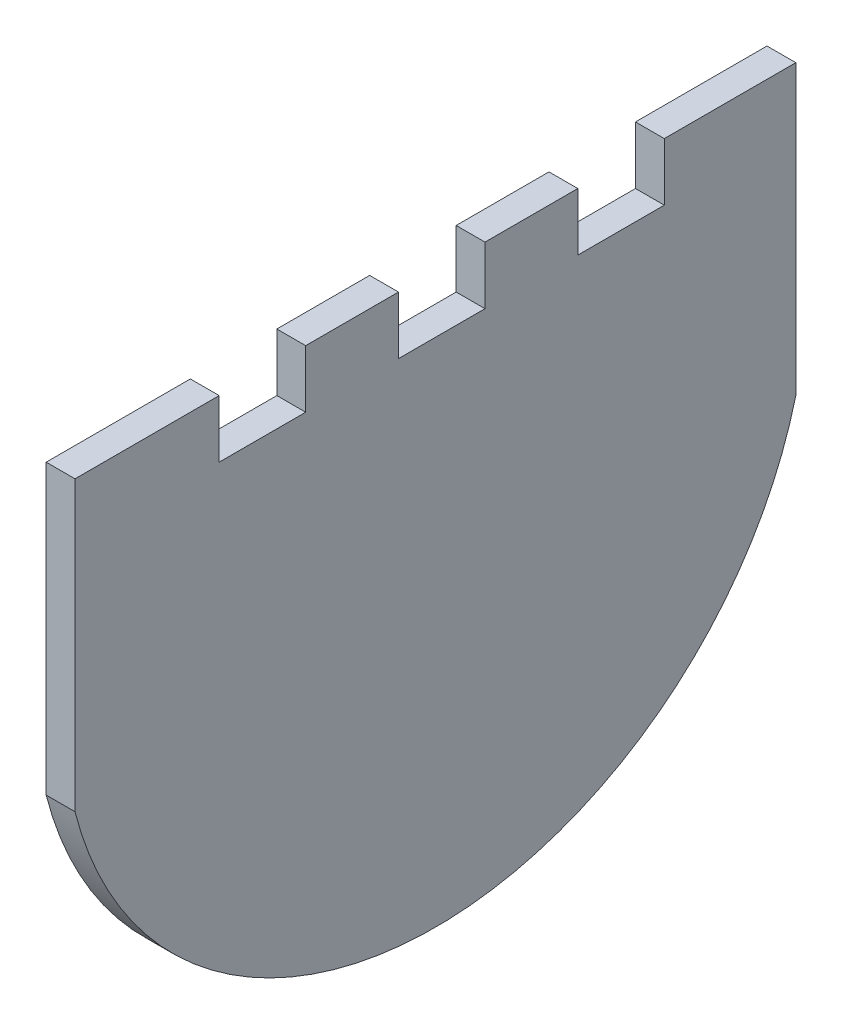
ISO-10303-21;
HEADER;
FILE_DESCRIPTION(('STEP AP214'),'2;1');
FILE_NAME('part.step','',(''),(''),'','','');
FILE_SCHEMA(('AUTOMOTIVE_DESIGN { 1 0 10303 214 1 1 1 1 }'));
ENDSEC;
DATA;
#1=APPLICATION_CONTEXT('core data for automotive mechanical design processes');
#2=APPLICATION_PROTOCOL_DEFINITION('international standard','automotive_design',2000,#1);
#3=PRODUCT_CONTEXT('',#1,'mechanical');
#4=PRODUCT('Part','Part','',(#3));
#5=PRODUCT_RELATED_PRODUCT_CATEGORY('part','',(#4));
#6=PRODUCT_DEFINITION_FORMATION('','',#4);
#7=PRODUCT_DEFINITION_CONTEXT('part definition',#1,'design');
#8=PRODUCT_DEFINITION('design','',#6,#7);
#9=PRODUCT_DEFINITION_SHAPE('','',#8);
#10=(LENGTH_UNIT() NAMED_UNIT(*) SI_UNIT(.MILLI.,.METRE.));
#11=(NAMED_UNIT(*) PLANE_ANGLE_UNIT() SI_UNIT($,.RADIAN.));
#12=(NAMED_UNIT(*) SI_UNIT($,.STERADIAN.) SOLID_ANGLE_UNIT());
#13=UNCERTAINTY_MEASURE_WITH_UNIT(LENGTH_MEASURE(1.E-05),#10,'distance_accuracy_value','');
#14=(GEOMETRIC_REPRESENTATION_CONTEXT(3) GLOBAL_UNCERTAINTY_ASSIGNED_CONTEXT((#13)) GLOBAL_UNIT_ASSIGNED_CONTEXT((#10,
#11,#12)) REPRESENTATION_CONTEXT('',''));
#15=CARTESIAN_POINT('',(0.,0.,0.));
#16=DIRECTION('',(0.,0.,1.));
#17=DIRECTION('',(1.,0.,0.));
#18=AXIS2_PLACEMENT_3D('',#15,#16,#17);
#19=CARTESIAN_POINT('',(2.54,33.3762697430089,-63.0518968689837));
#20=DIRECTION('',(0.,1.,0.));
#21=DIRECTION('',(0.,0.,1.));
#22=AXIS2_PLACEMENT_3D('',#19,#20,#21);
#23=PLANE('',#22);
#24=DIRECTION('',(-1.,0.,0.));
#25=VECTOR('',#24,1.);
#26=CARTESIAN_POINT('',(2.54,33.3762697430089,-20.1641641695142));
#27=LINE('',#26,#25);
#28=CARTESIAN_POINT('',(2.54,33.3762697430089,-20.1641641695142));
#29=VERTEX_POINT('',#28);
#30=CARTESIAN_POINT('',(0.,33.3762697430089,-20.1641641695142));
#31=VERTEX_POINT('',#30);
#32=EDGE_CURVE('E159',#29,#31,#27,.T.);
#33=ORIENTED_EDGE('',*,*,#32,.F.);
#34=DIRECTION('',(0.,0.,-1.));
#35=VECTOR('',#34,1.);
#36=CARTESIAN_POINT('',(2.54,33.3762697430089,-63.0518968689837));
#37=LINE('',#36,#35);
#38=CARTESIAN_POINT('',(2.54,33.3762697430089,-31.75));
#39=VERTEX_POINT('',#38);
#40=EDGE_CURVE('E228',#29,#39,#37,.T.);
#41=ORIENTED_EDGE('',*,*,#40,.T.);
#42=DIRECTION('',(-1.,0.,0.));
#43=VECTOR('',#42,1.);
#44=CARTESIAN_POINT('',(2.54,33.3762697430089,-31.75));
#45=LINE('',#44,#43);
#46=CARTESIAN_POINT('',(0.,33.3762697430089,-31.75));
#47=VERTEX_POINT('',#46);
#48=EDGE_CURVE('E247',#39,#47,#45,.T.);
#49=ORIENTED_EDGE('',*,*,#48,.T.);
#50=DIRECTION('',(0.,0.,-1.));
#51=VECTOR('',#50,1.);
#52=CARTESIAN_POINT('',(0.,33.3762697430089,-63.0518968689837));
#53=LINE('',#52,#51);
#54=EDGE_CURVE('E242',#31,#47,#53,.T.);
#55=ORIENTED_EDGE('',*,*,#54,.F.);
#56=EDGE_LOOP('',(#33,#41,#49,#55));
#57=FACE_BOUND('',#56,.T.);
#58=ADVANCED_FACE('F31',(#57),#23,.T.);
#59=DIRECTION('',(1.,0.,0.));
#60=VECTOR('',#59,1.);
#61=CARTESIAN_POINT('',(0.,33.3762697430089,-12.5441641695142));
#62=LINE('',#61,#60);
#63=CARTESIAN_POINT('',(0.,33.3762697430089,-12.5441641695142));
#64=VERTEX_POINT('',#63);
#65=CARTESIAN_POINT('',(2.54,33.3762697430089,-12.5441641695142));
#66=VERTEX_POINT('',#65);
#67=EDGE_CURVE('E308',#64,#66,#62,.T.);
#68=ORIENTED_EDGE('',*,*,#67,.F.);
#69=CARTESIAN_POINT('',(0.,33.3762697430089,-4.36708208475709));
#70=VERTEX_POINT('',#69);
#71=EDGE_CURVE('E165',#70,#64,#53,.T.);
#72=ORIENTED_EDGE('',*,*,#71,.F.);
#73=DIRECTION('',(-1.,0.,0.));
#74=VECTOR('',#73,1.);
#75=CARTESIAN_POINT('',(2.54,33.3762697430089,-4.36708208475709));
#76=LINE('',#75,#74);
#77=CARTESIAN_POINT('',(2.54,33.3762697430089,-4.36708208475709));
#78=VERTEX_POINT('',#77);
#79=EDGE_CURVE('E175',#78,#70,#76,.T.);
#80=ORIENTED_EDGE('',*,*,#79,.F.);
#81=EDGE_CURVE('E309',#78,#66,#37,.T.);
#82=ORIENTED_EDGE('',*,*,#81,.T.);
#83=EDGE_LOOP('',(#68,#72,#80,#82));
#84=FACE_BOUND('',#83,.T.);
#85=ADVANCED_FACE('F306',(#84),#23,.T.);
#86=DIRECTION('',(1.,0.,0.));
#87=VECTOR('',#86,1.);
#88=CARTESIAN_POINT('',(0.,33.3762697430089,3.2529179152429));
#89=LINE('',#88,#87);
#90=CARTESIAN_POINT('',(0.,33.3762697430089,3.2529179152429));
#91=VERTEX_POINT('',#90);
#92=CARTESIAN_POINT('',(2.54,33.3762697430089,3.2529179152429));
#93=VERTEX_POINT('',#92);
#94=EDGE_CURVE('E182',#91,#93,#89,.T.);
#95=ORIENTED_EDGE('',*,*,#94,.F.);
#96=CARTESIAN_POINT('',(0.,33.3762697430089,11.43));
#97=VERTEX_POINT('',#96);
#98=EDGE_CURVE('E245',#97,#91,#53,.T.);
#99=ORIENTED_EDGE('',*,*,#98,.F.);
#100=DIRECTION('',(-1.,0.,0.));
#101=VECTOR('',#100,1.);
#102=CARTESIAN_POINT('',(2.54,33.3762697430089,11.43));
#103=LINE('',#102,#101);
#104=CARTESIAN_POINT('',(2.54,33.3762697430089,11.43));
#105=VERTEX_POINT('',#104);
#106=EDGE_CURVE('E199',#105,#97,#103,.T.);
#107=ORIENTED_EDGE('',*,*,#106,.F.);
#108=EDGE_CURVE('E233',#105,#93,#37,.T.);
#109=ORIENTED_EDGE('',*,*,#108,.T.);
#110=EDGE_LOOP('',(#95,#99,#107,#109));
#111=FACE_BOUND('',#110,.T.);
#112=ADVANCED_FACE('F293',(#111),#23,.T.);
#113=CARTESIAN_POINT('',(2.54,8.32906901820324,31.75));
#114=DIRECTION('',(0.,0.,-1.));
#115=DIRECTION('',(-1.,0.,0.));
#116=AXIS2_PLACEMENT_3D('',#113,#114,#115);
#117=PLANE('',#116);
#118=DIRECTION('',(0.,-1.,0.));
#119=VECTOR('',#118,1.);
#120=CARTESIAN_POINT('',(0.,8.32906901820324,31.75));
#121=LINE('',#120,#119);
#122=CARTESIAN_POINT('',(0.,33.3762697430089,31.75));
#123=VERTEX_POINT('',#122);
#124=CARTESIAN_POINT('',(0.,7.97626974300889,31.75));
#125=VERTEX_POINT('',#124);
#126=EDGE_CURVE('E212',#123,#125,#121,.T.);
#127=ORIENTED_EDGE('',*,*,#126,.T.);
#128=DIRECTION('',(-1.,0.,0.));
#129=VECTOR('',#128,1.);
#130=CARTESIAN_POINT('',(2.54,7.97626974300889,31.75));
#131=LINE('',#130,#129);
#132=CARTESIAN_POINT('',(2.54,7.97626974300889,31.75));
#133=VERTEX_POINT('',#132);
#134=EDGE_CURVE('E11',#133,#125,#131,.T.);
#135=ORIENTED_EDGE('',*,*,#134,.F.);
#136=DIRECTION('',(0.,-1.,0.));
#137=VECTOR('',#136,1.);
#138=CARTESIAN_POINT('',(2.54,8.32906901820324,31.75));
#139=LINE('',#138,#137);
#140=CARTESIAN_POINT('',(2.54,33.3762697430089,31.75));
#141=VERTEX_POINT('',#140);
#142=EDGE_CURVE('E219',#141,#133,#139,.T.);
#143=ORIENTED_EDGE('',*,*,#142,.F.);
#144=DIRECTION('',(-1.,0.,0.));
#145=VECTOR('',#144,1.);
#146=CARTESIAN_POINT('',(2.54,33.3762697430089,31.75));
#147=LINE('',#146,#145);
#148=EDGE_CURVE('E232',#141,#123,#147,.T.);
#149=ORIENTED_EDGE('',*,*,#148,.T.);
#150=EDGE_LOOP('',(#127,#135,#143,#149));
#151=FACE_BOUND('',#150,.T.);
#152=ADVANCED_FACE('F33',(#151),#117,.F.);
#153=CARTESIAN_POINT('',(2.54,16.0398188405251,0.));
#154=DIRECTION('',(-1.,0.,0.));
#155=DIRECTION('',(0.,0.,1.));
#156=AXIS2_PLACEMENT_3D('',#153,#154,#155);
#157=CYLINDRICAL_SURFACE('',#156,32.7579505471276);
#158=CARTESIAN_POINT('',(0.,16.0398188405251,0.));
#159=DIRECTION('',(1.,0.,0.));
#160=DIRECTION('',(0.,0.,-1.));
#161=AXIS2_PLACEMENT_3D('',#158,#159,#160);
#162=CIRCLE('',#161,32.7579505471276);
#163=CARTESIAN_POINT('',(0.,7.97626974300889,-31.75));
#164=VERTEX_POINT('',#163);
#165=EDGE_CURVE('E236',#164,#125,#162,.F.);
#166=ORIENTED_EDGE('',*,*,#165,.F.);
#167=DIRECTION('',(-1.,0.,0.));
#168=VECTOR('',#167,1.);
#169=CARTESIAN_POINT('',(2.54,7.97626974300889,-31.75));
#170=LINE('',#169,#168);
#171=CARTESIAN_POINT('',(2.54,7.97626974300889,-31.75));
#172=VERTEX_POINT('',#171);
#173=EDGE_CURVE('E39',#172,#164,#170,.T.);
#174=ORIENTED_EDGE('',*,*,#173,.F.);
#175=CARTESIAN_POINT('',(2.54,16.0398188405251,0.));
#176=DIRECTION('',(1.,0.,0.));
#177=DIRECTION('',(0.,0.,-1.));
#178=AXIS2_PLACEMENT_3D('',#175,#176,#177);
#179=CIRCLE('',#178,32.7579505471276);
#180=EDGE_CURVE('E221',#172,#133,#179,.F.);
#181=ORIENTED_EDGE('',*,*,#180,.T.);
#182=ORIENTED_EDGE('',*,*,#134,.T.);
#183=EDGE_LOOP('',(#166,#174,#181,#182));
#184=FACE_BOUND('',#183,.T.);
#185=ADVANCED_FACE('F257',(#184),#157,.T.);
#186=CARTESIAN_POINT('',(2.54,8.32906901820326,-31.75));
#187=DIRECTION('',(0.,0.,-1.));
#188=DIRECTION('',(0.,1.,0.));
#189=AXIS2_PLACEMENT_3D('',#186,#187,#188);
#190=PLANE('',#189);
#191=DIRECTION('',(0.,-1.,0.));
#192=VECTOR('',#191,1.);
#193=CARTESIAN_POINT('',(0.,8.32906901820326,-31.75));
#194=LINE('',#193,#192);
#195=EDGE_CURVE('E239',#47,#164,#194,.T.);
#196=ORIENTED_EDGE('',*,*,#195,.F.);
#197=ORIENTED_EDGE('',*,*,#48,.F.);
#198=DIRECTION('',(0.,-1.,0.));
#199=VECTOR('',#198,1.);
#200=CARTESIAN_POINT('',(2.54,8.32906901820326,-31.75));
#201=LINE('',#200,#199);
#202=EDGE_CURVE('E225',#39,#172,#201,.T.);
#203=ORIENTED_EDGE('',*,*,#202,.T.);
#204=ORIENTED_EDGE('',*,*,#173,.T.);
#205=EDGE_LOOP('',(#196,#197,#203,#204));
#206=FACE_BOUND('',#205,.T.);
#207=ADVANCED_FACE('F252',(#206),#190,.T.);
#208=DIRECTION('',(1.,0.,0.));
#209=VECTOR('',#208,1.);
#210=CARTESIAN_POINT('',(0.,33.3762697430089,19.05));
#211=LINE('',#210,#209);
#212=CARTESIAN_POINT('',(0.,33.3762697430089,19.05));
#213=VERTEX_POINT('',#212);
#214=CARTESIAN_POINT('',(2.54,33.3762697430089,19.05));
#215=VERTEX_POINT('',#214);
#216=EDGE_CURVE('E188',#213,#215,#211,.T.);
#217=ORIENTED_EDGE('',*,*,#216,.F.);
#218=EDGE_CURVE('E222',#123,#213,#53,.T.);
#219=ORIENTED_EDGE('',*,*,#218,.F.);
#220=ORIENTED_EDGE('',*,*,#148,.F.);
#221=EDGE_CURVE('E229',#141,#215,#37,.T.);
#222=ORIENTED_EDGE('',*,*,#221,.T.);
#223=EDGE_LOOP('',(#217,#219,#220,#222));
#224=FACE_BOUND('',#223,.T.);
#225=ADVANCED_FACE('F274',(#224),#23,.T.);
#226=CARTESIAN_POINT('',(2.54,8.32906901820324,-63.0518968689837));
#227=DIRECTION('',(1.,0.,0.));
#228=DIRECTION('',(0.,0.,-1.));
#229=AXIS2_PLACEMENT_3D('',#226,#227,#228);
#230=PLANE('',#229);
#231=DIRECTION('',(0.,1.,0.));
#232=VECTOR('',#231,1.);
#233=CARTESIAN_POINT('',(2.54,28.2962697430089,-20.1641641695142));
#234=LINE('',#233,#232);
#235=CARTESIAN_POINT('',(2.54,28.2962697430089,-20.1641641695142));
#236=VERTEX_POINT('',#235);
#237=EDGE_CURVE('E167',#236,#29,#234,.T.);
#238=ORIENTED_EDGE('',*,*,#237,.F.);
#239=DIRECTION('',(0.,0.,-1.));
#240=VECTOR('',#239,1.);
#241=CARTESIAN_POINT('',(2.54,28.2962697430089,-12.5441641695142));
#242=LINE('',#241,#240);
#243=CARTESIAN_POINT('',(2.54,28.2962697430089,-12.5441641695142));
#244=VERTEX_POINT('',#243);
#245=EDGE_CURVE('E152',#244,#236,#242,.T.);
#246=ORIENTED_EDGE('',*,*,#245,.F.);
#247=DIRECTION('',(0.,1.,0.));
#248=VECTOR('',#247,1.);
#249=CARTESIAN_POINT('',(2.54,28.2962697430089,-12.5441641695142));
#250=LINE('',#249,#248);
#251=EDGE_CURVE('E150',#244,#66,#250,.T.);
#252=ORIENTED_EDGE('',*,*,#251,.T.);
#253=ORIENTED_EDGE('',*,*,#81,.F.);
#254=DIRECTION('',(0.,1.,0.));
#255=VECTOR('',#254,1.);
#256=CARTESIAN_POINT('',(2.54,28.2962697430089,-4.36708208475709));
#257=LINE('',#256,#255);
#258=CARTESIAN_POINT('',(2.54,28.2962697430089,-4.36708208475709));
#259=VERTEX_POINT('',#258);
#260=EDGE_CURVE('E189',#259,#78,#257,.T.);
#261=ORIENTED_EDGE('',*,*,#260,.F.);
#262=DIRECTION('',(0.,0.,-1.));
#263=VECTOR('',#262,1.);
#264=CARTESIAN_POINT('',(2.54,28.2962697430089,3.2529179152429));
#265=LINE('',#264,#263);
#266=CARTESIAN_POINT('',(2.54,28.2962697430089,3.2529179152429));
#267=VERTEX_POINT('',#266);
#268=EDGE_CURVE('E178',#267,#259,#265,.T.);
#269=ORIENTED_EDGE('',*,*,#268,.F.);
#270=DIRECTION('',(0.,1.,0.));
#271=VECTOR('',#270,1.);
#272=CARTESIAN_POINT('',(2.54,28.2962697430089,3.2529179152429));
#273=LINE('',#272,#271);
#274=EDGE_CURVE('E191',#267,#93,#273,.T.);
#275=ORIENTED_EDGE('',*,*,#274,.T.);
#276=ORIENTED_EDGE('',*,*,#108,.F.);
#277=DIRECTION('',(0.,1.,0.));
#278=VECTOR('',#277,1.);
#279=CARTESIAN_POINT('',(2.54,28.2962697430089,11.43));
#280=LINE('',#279,#278);
#281=CARTESIAN_POINT('',(2.54,28.2962697430089,11.43));
#282=VERTEX_POINT('',#281);
#283=EDGE_CURVE('E213',#282,#105,#280,.T.);
#284=ORIENTED_EDGE('',*,*,#283,.F.);
#285=DIRECTION('',(0.,0.,-1.));
#286=VECTOR('',#285,1.);
#287=CARTESIAN_POINT('',(2.54,28.2962697430089,19.05));
#288=LINE('',#287,#286);
#289=CARTESIAN_POINT('',(2.54,28.2962697430089,19.05));
#290=VERTEX_POINT('',#289);
#291=EDGE_CURVE('E202',#290,#282,#288,.T.);
#292=ORIENTED_EDGE('',*,*,#291,.F.);
#293=DIRECTION('',(0.,1.,0.));
#294=VECTOR('',#293,1.);
#295=CARTESIAN_POINT('',(2.54,28.2962697430089,19.05));
#296=LINE('',#295,#294);
#297=EDGE_CURVE('E215',#290,#215,#296,.T.);
#298=ORIENTED_EDGE('',*,*,#297,.T.);
#299=ORIENTED_EDGE('',*,*,#221,.F.);
#300=ORIENTED_EDGE('',*,*,#142,.T.);
#301=ORIENTED_EDGE('',*,*,#180,.F.);
#302=ORIENTED_EDGE('',*,*,#202,.F.);
#303=ORIENTED_EDGE('',*,*,#40,.F.);
#304=EDGE_LOOP('',(#238,#246,#252,#253,#261,#269,#275,#276,#284,#292,#298,#299,#300,#301,#302,#303));
#305=FACE_BOUND('',#304,.T.);
#306=ADVANCED_FACE('F266',(#305),#230,.T.);
#307=CARTESIAN_POINT('',(0.,8.32906901820324,-63.0518968689837));
#308=DIRECTION('',(1.,0.,0.));
#309=DIRECTION('',(0.,0.,-1.));
#310=AXIS2_PLACEMENT_3D('',#307,#308,#309);
#311=PLANE('',#310);
#312=DIRECTION('',(0.,0.,1.));
#313=VECTOR('',#312,1.);
#314=CARTESIAN_POINT('',(0.,28.2962697430089,-20.1641641695142));
#315=LINE('',#314,#313);
#316=CARTESIAN_POINT('',(0.,28.2962697430089,-20.1641641695142));
#317=VERTEX_POINT('',#316);
#318=CARTESIAN_POINT('',(0.,28.2962697430089,-12.5441641695142));
#319=VERTEX_POINT('',#318);
#320=EDGE_CURVE('E153',#317,#319,#315,.T.);
#321=ORIENTED_EDGE('',*,*,#320,.F.);
#322=DIRECTION('',(0.,1.,0.));
#323=VECTOR('',#322,1.);
#324=CARTESIAN_POINT('',(0.,28.2962697430089,-20.1641641695142));
#325=LINE('',#324,#323);
#326=EDGE_CURVE('E184',#317,#31,#325,.T.);
#327=ORIENTED_EDGE('',*,*,#326,.T.);
#328=ORIENTED_EDGE('',*,*,#54,.T.);
#329=ORIENTED_EDGE('',*,*,#195,.T.);
#330=ORIENTED_EDGE('',*,*,#165,.T.);
#331=ORIENTED_EDGE('',*,*,#126,.F.);
#332=ORIENTED_EDGE('',*,*,#218,.T.);
#333=DIRECTION('',(0.,1.,0.));
#334=VECTOR('',#333,1.);
#335=CARTESIAN_POINT('',(0.,28.2962697430089,19.05));
#336=LINE('',#335,#334);
#337=CARTESIAN_POINT('',(0.,28.2962697430089,19.05));
#338=VERTEX_POINT('',#337);
#339=EDGE_CURVE('E206',#338,#213,#336,.T.);
#340=ORIENTED_EDGE('',*,*,#339,.F.);
#341=DIRECTION('',(0.,0.,1.));
#342=VECTOR('',#341,1.);
#343=CARTESIAN_POINT('',(0.,28.2962697430089,11.43));
#344=LINE('',#343,#342);
#345=CARTESIAN_POINT('',(0.,28.2962697430089,11.43));
#346=VERTEX_POINT('',#345);
#347=EDGE_CURVE('E195',#346,#338,#344,.T.);
#348=ORIENTED_EDGE('',*,*,#347,.F.);
#349=DIRECTION('',(0.,1.,0.));
#350=VECTOR('',#349,1.);
#351=CARTESIAN_POINT('',(0.,28.2962697430089,11.43));
#352=LINE('',#351,#350);
#353=EDGE_CURVE('E209',#346,#97,#352,.T.);
#354=ORIENTED_EDGE('',*,*,#353,.T.);
#355=ORIENTED_EDGE('',*,*,#98,.T.);
#356=DIRECTION('',(0.,1.,0.));
#357=VECTOR('',#356,1.);
#358=CARTESIAN_POINT('',(0.,28.2962697430089,3.2529179152429));
#359=LINE('',#358,#357);
#360=CARTESIAN_POINT('',(0.,28.2962697430089,3.2529179152429));
#361=VERTEX_POINT('',#360);
#362=EDGE_CURVE('E181',#361,#91,#359,.T.);
#363=ORIENTED_EDGE('',*,*,#362,.F.);
#364=DIRECTION('',(0.,0.,1.));
#365=VECTOR('',#364,1.);
#366=CARTESIAN_POINT('',(0.,28.2962697430089,-4.36708208475709));
#367=LINE('',#366,#365);
#368=CARTESIAN_POINT('',(0.,28.2962697430089,-4.36708208475709));
#369=VERTEX_POINT('',#368);
#370=EDGE_CURVE('E172',#369,#361,#367,.T.);
#371=ORIENTED_EDGE('',*,*,#370,.F.);
#372=DIRECTION('',(0.,1.,0.));
#373=VECTOR('',#372,1.);
#374=CARTESIAN_POINT('',(0.,28.2962697430089,-4.36708208475709));
#375=LINE('',#374,#373);
#376=EDGE_CURVE('E186',#369,#70,#375,.T.);
#377=ORIENTED_EDGE('',*,*,#376,.T.);
#378=ORIENTED_EDGE('',*,*,#71,.T.);
#379=DIRECTION('',(0.,1.,0.));
#380=VECTOR('',#379,1.);
#381=CARTESIAN_POINT('',(0.,28.2962697430089,-12.5441641695142));
#382=LINE('',#381,#380);
#383=EDGE_CURVE('E147',#319,#64,#382,.T.);
#384=ORIENTED_EDGE('',*,*,#383,.F.);
#385=EDGE_LOOP('',(#321,#327,#328,#329,#330,#331,#332,#340,#348,#354,#355,#363,#371,#377,#378,#384));
#386=FACE_BOUND('',#385,.T.);
#387=ADVANCED_FACE('F162',(#386),#311,.F.);
#388=CARTESIAN_POINT('',(2.54,28.2962697430089,11.43));
#389=DIRECTION('',(0.,0.,-1.));
#390=DIRECTION('',(-1.,0.,0.));
#391=AXIS2_PLACEMENT_3D('',#388,#389,#390);
#392=PLANE('',#391);
#393=ORIENTED_EDGE('',*,*,#106,.T.);
#394=ORIENTED_EDGE('',*,*,#353,.F.);
#395=DIRECTION('',(-1.,0.,0.));
#396=VECTOR('',#395,1.);
#397=CARTESIAN_POINT('',(2.54,28.2962697430089,11.43));
#398=LINE('',#397,#396);
#399=EDGE_CURVE('E204',#282,#346,#398,.T.);
#400=ORIENTED_EDGE('',*,*,#399,.F.);
#401=ORIENTED_EDGE('',*,*,#283,.T.);
#402=EDGE_LOOP('',(#393,#394,#400,#401));
#403=FACE_BOUND('',#402,.T.);
#404=ADVANCED_FACE('F285',(#403),#392,.F.);
#405=CARTESIAN_POINT('',(0.,28.2962697430089,19.05));
#406=DIRECTION('',(0.,0.,1.));
#407=DIRECTION('',(0.,-1.,0.));
#408=AXIS2_PLACEMENT_3D('',#405,#406,#407);
#409=PLANE('',#408);
#410=ORIENTED_EDGE('',*,*,#216,.T.);
#411=ORIENTED_EDGE('',*,*,#297,.F.);
#412=DIRECTION('',(1.,0.,0.));
#413=VECTOR('',#412,1.);
#414=CARTESIAN_POINT('',(0.,28.2962697430089,19.05));
#415=LINE('',#414,#413);
#416=EDGE_CURVE('E198',#338,#290,#415,.T.);
#417=ORIENTED_EDGE('',*,*,#416,.F.);
#418=ORIENTED_EDGE('',*,*,#339,.T.);
#419=EDGE_LOOP('',(#410,#411,#417,#418));
#420=FACE_BOUND('',#419,.T.);
#421=ADVANCED_FACE('F276',(#420),#409,.F.);
#422=CARTESIAN_POINT('',(0.,28.2962697430089,19.05));
#423=DIRECTION('',(0.,1.,0.));
#424=DIRECTION('',(0.,0.,1.));
#425=AXIS2_PLACEMENT_3D('',#422,#423,#424);
#426=PLANE('',#425);
#427=ORIENTED_EDGE('',*,*,#347,.T.);
#428=ORIENTED_EDGE('',*,*,#416,.T.);
#429=ORIENTED_EDGE('',*,*,#291,.T.);
#430=ORIENTED_EDGE('',*,*,#399,.T.);
#431=EDGE_LOOP('',(#427,#428,#429,#430));
#432=FACE_BOUND('',#431,.T.);
#433=ADVANCED_FACE('F282',(#432),#426,.T.);
#434=CARTESIAN_POINT('',(2.54,28.2962697430089,-4.36708208475709));
#435=DIRECTION('',(0.,0.,-1.));
#436=DIRECTION('',(-1.,0.,0.));
#437=AXIS2_PLACEMENT_3D('',#434,#435,#436);
#438=PLANE('',#437);
#439=ORIENTED_EDGE('',*,*,#79,.T.);
#440=ORIENTED_EDGE('',*,*,#376,.F.);
#441=DIRECTION('',(-1.,0.,0.));
#442=VECTOR('',#441,1.);
#443=CARTESIAN_POINT('',(2.54,28.2962697430089,-4.36708208475709));
#444=LINE('',#443,#442);
#445=EDGE_CURVE('E54',#259,#369,#444,.T.);
#446=ORIENTED_EDGE('',*,*,#445,.F.);
#447=ORIENTED_EDGE('',*,*,#260,.T.);
#448=EDGE_LOOP('',(#439,#440,#446,#447));
#449=FACE_BOUND('',#448,.T.);
#450=ADVANCED_FACE('F302',(#449),#438,.F.);
#451=CARTESIAN_POINT('',(0.,28.2962697430089,3.2529179152429));
#452=DIRECTION('',(0.,0.,1.));
#453=DIRECTION('',(0.,-1.,0.));
#454=AXIS2_PLACEMENT_3D('',#451,#452,#453);
#455=PLANE('',#454);
#456=ORIENTED_EDGE('',*,*,#94,.T.);
#457=ORIENTED_EDGE('',*,*,#274,.F.);
#458=DIRECTION('',(1.,0.,0.));
#459=VECTOR('',#458,1.);
#460=CARTESIAN_POINT('',(0.,28.2962697430089,3.2529179152429));
#461=LINE('',#460,#459);
#462=EDGE_CURVE('E174',#361,#267,#461,.T.);
#463=ORIENTED_EDGE('',*,*,#462,.F.);
#464=ORIENTED_EDGE('',*,*,#362,.T.);
#465=EDGE_LOOP('',(#456,#457,#463,#464));
#466=FACE_BOUND('',#465,.T.);
#467=ADVANCED_FACE('F296',(#466),#455,.F.);
#468=CARTESIAN_POINT('',(0.,28.2962697430089,3.2529179152429));
#469=DIRECTION('',(0.,1.,0.));
#470=DIRECTION('',(0.,0.,1.));
#471=AXIS2_PLACEMENT_3D('',#468,#469,#470);
#472=PLANE('',#471);
#473=ORIENTED_EDGE('',*,*,#370,.T.);
#474=ORIENTED_EDGE('',*,*,#462,.T.);
#475=ORIENTED_EDGE('',*,*,#268,.T.);
#476=ORIENTED_EDGE('',*,*,#445,.T.);
#477=EDGE_LOOP('',(#473,#474,#475,#476));
#478=FACE_BOUND('',#477,.T.);
#479=ADVANCED_FACE('F300',(#478),#472,.T.);
#480=CARTESIAN_POINT('',(2.54,28.2962697430089,-20.1641641695142));
#481=DIRECTION('',(0.,0.,-1.));
#482=DIRECTION('',(0.,1.,0.));
#483=AXIS2_PLACEMENT_3D('',#480,#481,#482);
#484=PLANE('',#483);
#485=ORIENTED_EDGE('',*,*,#32,.T.);
#486=ORIENTED_EDGE('',*,*,#326,.F.);
#487=DIRECTION('',(-1.,0.,0.));
#488=VECTOR('',#487,1.);
#489=CARTESIAN_POINT('',(2.54,28.2962697430089,-20.1641641695142));
#490=LINE('',#489,#488);
#491=EDGE_CURVE('E46',#236,#317,#490,.T.);
#492=ORIENTED_EDGE('',*,*,#491,.F.);
#493=ORIENTED_EDGE('',*,*,#237,.T.);
#494=EDGE_LOOP('',(#485,#486,#492,#493));
#495=FACE_BOUND('',#494,.T.);
#496=ADVANCED_FACE('F315',(#495),#484,.F.);
#497=CARTESIAN_POINT('',(0.,28.2962697430089,-12.5441641695142));
#498=DIRECTION('',(0.,0.,1.));
#499=DIRECTION('',(0.,-1.,0.));
#500=AXIS2_PLACEMENT_3D('',#497,#498,#499);
#501=PLANE('',#500);
#502=ORIENTED_EDGE('',*,*,#67,.T.);
#503=ORIENTED_EDGE('',*,*,#251,.F.);
#504=DIRECTION('',(1.,0.,0.));
#505=VECTOR('',#504,1.);
#506=CARTESIAN_POINT('',(0.,28.2962697430089,-12.5441641695142));
#507=LINE('',#506,#505);
#508=EDGE_CURVE('E144',#319,#244,#507,.T.);
#509=ORIENTED_EDGE('',*,*,#508,.F.);
#510=ORIENTED_EDGE('',*,*,#383,.T.);
#511=EDGE_LOOP('',(#502,#503,#509,#510));
#512=FACE_BOUND('',#511,.T.);
#513=ADVANCED_FACE('F145',(#512),#501,.F.);
#514=CARTESIAN_POINT('',(0.,28.2962697430089,-12.5441641695142));
#515=DIRECTION('',(0.,1.,0.));
#516=DIRECTION('',(0.,0.,1.));
#517=AXIS2_PLACEMENT_3D('',#514,#515,#516);
#518=PLANE('',#517);
#519=ORIENTED_EDGE('',*,*,#320,.T.);
#520=ORIENTED_EDGE('',*,*,#508,.T.);
#521=ORIENTED_EDGE('',*,*,#245,.T.);
#522=ORIENTED_EDGE('',*,*,#491,.T.);
#523=EDGE_LOOP('',(#519,#520,#521,#522));
#524=FACE_BOUND('',#523,.T.);
#525=ADVANCED_FACE('F156',(#524),#518,.T.);
#526=CLOSED_SHELL('',(#58,#85,#112,#152,#185,#207,#225,#306,#387,#404,#421,#433,#450,#467,#479,
#496,#513,#525));
#527=MANIFOLD_SOLID_BREP('B2',#526);
#528=ADVANCED_BREP_SHAPE_REPRESENTATION('',(#18,#527),#14);
#529=SHAPE_DEFINITION_REPRESENTATION(#9,#528);
ENDSEC;
END-ISO-10303-21;
